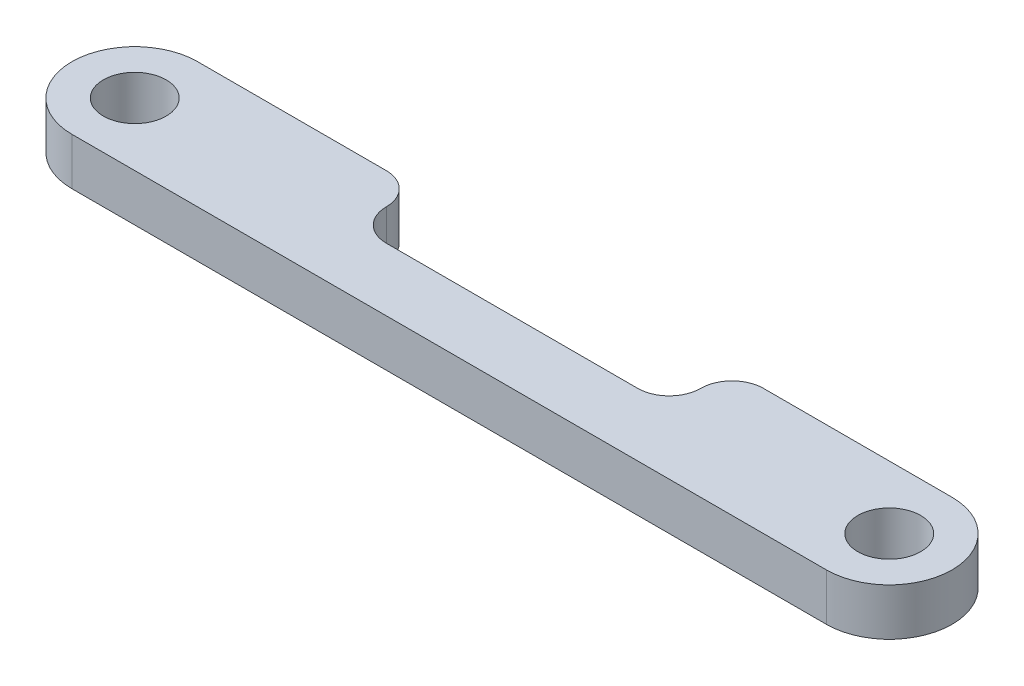
ISO-10303-21;
HEADER;
FILE_DESCRIPTION(('STEP AP214'),'2;1');
FILE_NAME('part.step','',(''),(''),'','','');
FILE_SCHEMA(('AUTOMOTIVE_DESIGN { 1 0 10303 214 1 1 1 1 }'));
ENDSEC;
DATA;
#1=APPLICATION_CONTEXT('core data for automotive mechanical design processes');
#2=APPLICATION_PROTOCOL_DEFINITION('international standard','automotive_design',2000,#1);
#3=PRODUCT_CONTEXT('',#1,'mechanical');
#4=PRODUCT('Part','Part','',(#3));
#5=PRODUCT_RELATED_PRODUCT_CATEGORY('part','',(#4));
#6=PRODUCT_DEFINITION_FORMATION('','',#4);
#7=PRODUCT_DEFINITION_CONTEXT('part definition',#1,'design');
#8=PRODUCT_DEFINITION('design','',#6,#7);
#9=PRODUCT_DEFINITION_SHAPE('','',#8);
#10=(LENGTH_UNIT() NAMED_UNIT(*) SI_UNIT(.MILLI.,.METRE.));
#11=(NAMED_UNIT(*) PLANE_ANGLE_UNIT() SI_UNIT($,.RADIAN.));
#12=(NAMED_UNIT(*) SI_UNIT($,.STERADIAN.) SOLID_ANGLE_UNIT());
#13=UNCERTAINTY_MEASURE_WITH_UNIT(LENGTH_MEASURE(1.E-05),#10,'distance_accuracy_value','');
#14=(GEOMETRIC_REPRESENTATION_CONTEXT(3) GLOBAL_UNCERTAINTY_ASSIGNED_CONTEXT((#13)) GLOBAL_UNIT_ASSIGNED_CONTEXT((#10,
#11,#12)) REPRESENTATION_CONTEXT('',''));
#15=CARTESIAN_POINT('',(0.,0.,0.));
#16=DIRECTION('',(0.,0.,1.));
#17=DIRECTION('',(1.,0.,0.));
#18=AXIS2_PLACEMENT_3D('',#15,#16,#17);
#19=CARTESIAN_POINT('',(15.24,1.905,0.));
#20=DIRECTION('',(0.,1.,0.));
#21=DIRECTION('',(0.,0.,1.));
#22=AXIS2_PLACEMENT_3D('',#19,#20,#21);
#23=PLANE('',#22);
#24=CARTESIAN_POINT('',(-15.24,1.905,0.));
#25=DIRECTION('',(0.,1.,0.));
#26=DIRECTION('',(0.,0.,1.));
#27=AXIS2_PLACEMENT_3D('',#24,#25,#26);
#28=CIRCLE('',#27,1.27);
#29=CARTESIAN_POINT('',(-15.24,1.905,-1.27));
#30=VERTEX_POINT('',#29);
#31=EDGE_CURVE('E151',#30,#30,#28,.T.);
#32=ORIENTED_EDGE('',*,*,#31,.F.);
#33=EDGE_LOOP('',(#32));
#34=FACE_BOUND('',#33,.T.);
#35=DIRECTION('',(-1.,0.,0.));
#36=VECTOR('',#35,1.);
#37=CARTESIAN_POINT('',(15.24,1.905,-2.54));
#38=LINE('',#37,#36);
#39=CARTESIAN_POINT('',(15.24,1.905,-2.54));
#40=VERTEX_POINT('',#39);
#41=CARTESIAN_POINT('',(7.62,1.905,-2.54));
#42=VERTEX_POINT('',#41);
#43=EDGE_CURVE('E144',#40,#42,#38,.T.);
#44=ORIENTED_EDGE('',*,*,#43,.T.);
#45=CARTESIAN_POINT('',(7.62,1.905,-1.27));
#46=DIRECTION('',(0.,1.,0.));
#47=DIRECTION('',(0.,0.,1.));
#48=AXIS2_PLACEMENT_3D('',#45,#46,#47);
#49=CIRCLE('',#48,1.27);
#50=CARTESIAN_POINT('',(6.35,1.905,-1.27));
#51=VERTEX_POINT('',#50);
#52=EDGE_CURVE('E175',#42,#51,#49,.T.);
#53=ORIENTED_EDGE('',*,*,#52,.T.);
#54=CARTESIAN_POINT('',(5.08,1.905,-1.27));
#55=DIRECTION('',(0.,1.,0.));
#56=DIRECTION('',(0.,0.,1.));
#57=AXIS2_PLACEMENT_3D('',#54,#55,#56);
#58=CIRCLE('',#57,1.27);
#59=CARTESIAN_POINT('',(5.08,1.905,0.));
#60=VERTEX_POINT('',#59);
#61=EDGE_CURVE('E57',#51,#60,#58,.F.);
#62=ORIENTED_EDGE('',*,*,#61,.T.);
#63=DIRECTION('',(-1.,0.,0.));
#64=VECTOR('',#63,1.);
#65=CARTESIAN_POINT('',(-6.35,1.905,0.));
#66=LINE('',#65,#64);
#67=CARTESIAN_POINT('',(-5.08,1.905,0.));
#68=VERTEX_POINT('',#67);
#69=EDGE_CURVE('E146',#60,#68,#66,.T.);
#70=ORIENTED_EDGE('',*,*,#69,.T.);
#71=CARTESIAN_POINT('',(-5.08,1.905,-1.27));
#72=DIRECTION('',(0.,1.,0.));
#73=DIRECTION('',(0.,0.,1.));
#74=AXIS2_PLACEMENT_3D('',#71,#72,#73);
#75=CIRCLE('',#74,1.27);
#76=CARTESIAN_POINT('',(-6.35,1.905,-1.27));
#77=VERTEX_POINT('',#76);
#78=EDGE_CURVE('E11',#68,#77,#75,.F.);
#79=ORIENTED_EDGE('',*,*,#78,.T.);
#80=CARTESIAN_POINT('',(-7.62,1.905,-1.27));
#81=DIRECTION('',(0.,1.,0.));
#82=DIRECTION('',(0.,0.,1.));
#83=AXIS2_PLACEMENT_3D('',#80,#81,#82);
#84=CIRCLE('',#83,1.27);
#85=CARTESIAN_POINT('',(-7.62,1.905,-2.54));
#86=VERTEX_POINT('',#85);
#87=EDGE_CURVE('E119',#77,#86,#84,.T.);
#88=ORIENTED_EDGE('',*,*,#87,.T.);
#89=DIRECTION('',(-1.,0.,0.));
#90=VECTOR('',#89,1.);
#91=CARTESIAN_POINT('',(-15.24,1.905,-2.54));
#92=LINE('',#91,#90);
#93=CARTESIAN_POINT('',(-15.24,1.905,-2.54));
#94=VERTEX_POINT('',#93);
#95=EDGE_CURVE('E111',#86,#94,#92,.T.);
#96=ORIENTED_EDGE('',*,*,#95,.T.);
#97=CARTESIAN_POINT('',(-15.24,1.905,0.));
#98=DIRECTION('',(0.,1.,0.));
#99=DIRECTION('',(0.,0.,-1.));
#100=AXIS2_PLACEMENT_3D('',#97,#98,#99);
#101=CIRCLE('',#100,2.54);
#102=CARTESIAN_POINT('',(-15.24,1.905,2.54));
#103=VERTEX_POINT('',#102);
#104=EDGE_CURVE('E116',#94,#103,#101,.T.);
#105=ORIENTED_EDGE('',*,*,#104,.T.);
#106=DIRECTION('',(1.,0.,0.));
#107=VECTOR('',#106,1.);
#108=CARTESIAN_POINT('',(-15.24,1.905,2.54));
#109=LINE('',#108,#107);
#110=CARTESIAN_POINT('',(15.24,1.905,2.54));
#111=VERTEX_POINT('',#110);
#112=EDGE_CURVE('E137',#103,#111,#109,.T.);
#113=ORIENTED_EDGE('',*,*,#112,.T.);
#114=CARTESIAN_POINT('',(15.24,1.905,0.));
#115=DIRECTION('',(0.,1.,0.));
#116=DIRECTION('',(0.,0.,1.));
#117=AXIS2_PLACEMENT_3D('',#114,#115,#116);
#118=CIRCLE('',#117,2.54);
#119=EDGE_CURVE('E139',#111,#40,#118,.T.);
#120=ORIENTED_EDGE('',*,*,#119,.T.);
#121=EDGE_LOOP('',(#44,#53,#62,#70,#79,#88,#96,#105,#113,#120));
#122=FACE_BOUND('',#121,.T.);
#123=CARTESIAN_POINT('',(15.24,1.905,0.));
#124=DIRECTION('',(0.,1.,0.));
#125=DIRECTION('',(0.,0.,1.));
#126=AXIS2_PLACEMENT_3D('',#123,#124,#125);
#127=CIRCLE('',#126,1.27);
#128=CARTESIAN_POINT('',(15.24,1.905,-1.27));
#129=VERTEX_POINT('',#128);
#130=EDGE_CURVE('E193',#129,#129,#127,.T.);
#131=ORIENTED_EDGE('',*,*,#130,.F.);
#132=EDGE_LOOP('',(#131));
#133=FACE_BOUND('',#132,.T.);
#134=ADVANCED_FACE('F34',(#34,#122,#133),#23,.T.);
#135=CARTESIAN_POINT('',(15.24,0.,0.));
#136=DIRECTION('',(0.,1.,0.));
#137=DIRECTION('',(0.,0.,1.));
#138=AXIS2_PLACEMENT_3D('',#135,#136,#137);
#139=PLANE('',#138);
#140=DIRECTION('',(-1.,0.,0.));
#141=VECTOR('',#140,1.);
#142=CARTESIAN_POINT('',(-6.35,0.,0.));
#143=LINE('',#142,#141);
#144=CARTESIAN_POINT('',(5.08,0.,0.));
#145=VERTEX_POINT('',#144);
#146=CARTESIAN_POINT('',(-5.08,0.,0.));
#147=VERTEX_POINT('',#146);
#148=EDGE_CURVE('E122',#145,#147,#143,.T.);
#149=ORIENTED_EDGE('',*,*,#148,.F.);
#150=CARTESIAN_POINT('',(5.08,0.,-1.27));
#151=DIRECTION('',(0.,1.,0.));
#152=DIRECTION('',(0.,0.,1.));
#153=AXIS2_PLACEMENT_3D('',#150,#151,#152);
#154=CIRCLE('',#153,1.27);
#155=CARTESIAN_POINT('',(6.35,0.,-1.27));
#156=VERTEX_POINT('',#155);
#157=EDGE_CURVE('E183',#145,#156,#154,.T.);
#158=ORIENTED_EDGE('',*,*,#157,.T.);
#159=CARTESIAN_POINT('',(7.62,0.,-1.27));
#160=DIRECTION('',(0.,1.,0.));
#161=DIRECTION('',(0.,0.,1.));
#162=AXIS2_PLACEMENT_3D('',#159,#160,#161);
#163=CIRCLE('',#162,1.27);
#164=CARTESIAN_POINT('',(7.62,0.,-2.54));
#165=VERTEX_POINT('',#164);
#166=EDGE_CURVE('E169',#156,#165,#163,.F.);
#167=ORIENTED_EDGE('',*,*,#166,.T.);
#168=DIRECTION('',(-1.,0.,0.));
#169=VECTOR('',#168,1.);
#170=CARTESIAN_POINT('',(15.24,0.,-2.54));
#171=LINE('',#170,#169);
#172=CARTESIAN_POINT('',(15.24,0.,-2.54));
#173=VERTEX_POINT('',#172);
#174=EDGE_CURVE('E157',#173,#165,#171,.T.);
#175=ORIENTED_EDGE('',*,*,#174,.F.);
#176=CARTESIAN_POINT('',(15.24,0.,0.));
#177=DIRECTION('',(0.,1.,0.));
#178=DIRECTION('',(0.,0.,1.));
#179=AXIS2_PLACEMENT_3D('',#176,#177,#178);
#180=CIRCLE('',#179,2.54);
#181=CARTESIAN_POINT('',(15.24,0.,2.54));
#182=VERTEX_POINT('',#181);
#183=EDGE_CURVE('E155',#182,#173,#180,.T.);
#184=ORIENTED_EDGE('',*,*,#183,.F.);
#185=DIRECTION('',(1.,0.,0.));
#186=VECTOR('',#185,1.);
#187=CARTESIAN_POINT('',(-15.24,0.,2.54));
#188=LINE('',#187,#186);
#189=CARTESIAN_POINT('',(-15.24,0.,2.54));
#190=VERTEX_POINT('',#189);
#191=EDGE_CURVE('E153',#190,#182,#188,.T.);
#192=ORIENTED_EDGE('',*,*,#191,.F.);
#193=CARTESIAN_POINT('',(-15.24,0.,0.));
#194=DIRECTION('',(0.,1.,0.));
#195=DIRECTION('',(0.,0.,-1.));
#196=AXIS2_PLACEMENT_3D('',#193,#194,#195);
#197=CIRCLE('',#196,2.54);
#198=CARTESIAN_POINT('',(-15.24,0.,-2.54));
#199=VERTEX_POINT('',#198);
#200=EDGE_CURVE('E150',#199,#190,#197,.T.);
#201=ORIENTED_EDGE('',*,*,#200,.F.);
#202=DIRECTION('',(-1.,0.,0.));
#203=VECTOR('',#202,1.);
#204=CARTESIAN_POINT('',(-15.24,0.,-2.54));
#205=LINE('',#204,#203);
#206=CARTESIAN_POINT('',(-7.62,0.,-2.54));
#207=VERTEX_POINT('',#206);
#208=EDGE_CURVE('E128',#207,#199,#205,.T.);
#209=ORIENTED_EDGE('',*,*,#208,.F.);
#210=CARTESIAN_POINT('',(-7.62,0.,-1.27));
#211=DIRECTION('',(0.,1.,0.));
#212=DIRECTION('',(0.,0.,1.));
#213=AXIS2_PLACEMENT_3D('',#210,#211,#212);
#214=CIRCLE('',#213,1.27);
#215=CARTESIAN_POINT('',(-6.35,0.,-1.27));
#216=VERTEX_POINT('',#215);
#217=EDGE_CURVE('E131',#207,#216,#214,.F.);
#218=ORIENTED_EDGE('',*,*,#217,.T.);
#219=CARTESIAN_POINT('',(-5.08,0.,-1.27));
#220=DIRECTION('',(0.,1.,0.));
#221=DIRECTION('',(0.,0.,1.));
#222=AXIS2_PLACEMENT_3D('',#219,#220,#221);
#223=CIRCLE('',#222,1.27);
#224=EDGE_CURVE('E43',#216,#147,#223,.T.);
#225=ORIENTED_EDGE('',*,*,#224,.T.);
#226=EDGE_LOOP('',(#149,#158,#167,#175,#184,#192,#201,#209,#218,#225));
#227=FACE_BOUND('',#226,.T.);
#228=CARTESIAN_POINT('',(-15.24,0.,0.));
#229=DIRECTION('',(0.,1.,0.));
#230=DIRECTION('',(0.,0.,1.));
#231=AXIS2_PLACEMENT_3D('',#228,#229,#230);
#232=CIRCLE('',#231,1.27);
#233=CARTESIAN_POINT('',(-15.24,0.,-1.27));
#234=VERTEX_POINT('',#233);
#235=EDGE_CURVE('E256',#234,#234,#232,.T.);
#236=ORIENTED_EDGE('',*,*,#235,.T.);
#237=EDGE_LOOP('',(#236));
#238=FACE_BOUND('',#237,.T.);
#239=CARTESIAN_POINT('',(15.24,0.,0.));
#240=DIRECTION('',(0.,1.,0.));
#241=DIRECTION('',(0.,0.,1.));
#242=AXIS2_PLACEMENT_3D('',#239,#240,#241);
#243=CIRCLE('',#242,1.27);
#244=CARTESIAN_POINT('',(15.24,0.,-1.27));
#245=VERTEX_POINT('',#244);
#246=EDGE_CURVE('E188',#245,#245,#243,.T.);
#247=ORIENTED_EDGE('',*,*,#246,.T.);
#248=EDGE_LOOP('',(#247));
#249=FACE_BOUND('',#248,.T.);
#250=ADVANCED_FACE('F202',(#227,#238,#249),#139,.F.);
#251=CARTESIAN_POINT('',(-15.24,1.905,-2.54));
#252=DIRECTION('',(0.,0.,1.));
#253=DIRECTION('',(1.,0.,0.));
#254=AXIS2_PLACEMENT_3D('',#251,#252,#253);
#255=PLANE('',#254);
#256=ORIENTED_EDGE('',*,*,#95,.F.);
#257=DIRECTION('',(0.,-1.,0.));
#258=VECTOR('',#257,1.);
#259=CARTESIAN_POINT('',(-7.62,1.905,-2.54));
#260=LINE('',#259,#258);
#261=EDGE_CURVE('E181',#86,#207,#260,.T.);
#262=ORIENTED_EDGE('',*,*,#261,.T.);
#263=ORIENTED_EDGE('',*,*,#208,.T.);
#264=DIRECTION('',(0.,-1.,0.));
#265=VECTOR('',#264,1.);
#266=CARTESIAN_POINT('',(-15.24,1.905,-2.54));
#267=LINE('',#266,#265);
#268=EDGE_CURVE('E125',#94,#199,#267,.T.);
#269=ORIENTED_EDGE('',*,*,#268,.F.);
#270=EDGE_LOOP('',(#256,#262,#263,#269));
#271=FACE_BOUND('',#270,.T.);
#272=ADVANCED_FACE('F126',(#271),#255,.F.);
#273=CARTESIAN_POINT('',(-15.24,1.905,0.));
#274=DIRECTION('',(0.,-1.,0.));
#275=DIRECTION('',(0.,0.,-1.));
#276=AXIS2_PLACEMENT_3D('',#273,#274,#275);
#277=CYLINDRICAL_SURFACE('',#276,2.54);
#278=ORIENTED_EDGE('',*,*,#200,.T.);
#279=DIRECTION('',(0.,-1.,0.));
#280=VECTOR('',#279,1.);
#281=CARTESIAN_POINT('',(-15.24,1.905,2.54));
#282=LINE('',#281,#280);
#283=EDGE_CURVE('E132',#103,#190,#282,.T.);
#284=ORIENTED_EDGE('',*,*,#283,.F.);
#285=ORIENTED_EDGE('',*,*,#104,.F.);
#286=ORIENTED_EDGE('',*,*,#268,.T.);
#287=EDGE_LOOP('',(#278,#284,#285,#286));
#288=FACE_BOUND('',#287,.T.);
#289=ADVANCED_FACE('F134',(#288),#277,.T.);
#290=CARTESIAN_POINT('',(-15.24,1.905,2.54));
#291=DIRECTION('',(0.,0.,-1.));
#292=DIRECTION('',(-1.,0.,0.));
#293=AXIS2_PLACEMENT_3D('',#290,#291,#292);
#294=PLANE('',#293);
#295=ORIENTED_EDGE('',*,*,#191,.T.);
#296=DIRECTION('',(0.,-1.,0.));
#297=VECTOR('',#296,1.);
#298=CARTESIAN_POINT('',(15.24,1.905,2.54));
#299=LINE('',#298,#297);
#300=EDGE_CURVE('E164',#111,#182,#299,.T.);
#301=ORIENTED_EDGE('',*,*,#300,.F.);
#302=ORIENTED_EDGE('',*,*,#112,.F.);
#303=ORIENTED_EDGE('',*,*,#283,.T.);
#304=EDGE_LOOP('',(#295,#301,#302,#303));
#305=FACE_BOUND('',#304,.T.);
#306=ADVANCED_FACE('F207',(#305),#294,.F.);
#307=CARTESIAN_POINT('',(15.24,1.905,0.));
#308=DIRECTION('',(0.,-1.,0.));
#309=DIRECTION('',(0.,0.,-1.));
#310=AXIS2_PLACEMENT_3D('',#307,#308,#309);
#311=CYLINDRICAL_SURFACE('',#310,2.54);
#312=ORIENTED_EDGE('',*,*,#183,.T.);
#313=DIRECTION('',(0.,-1.,0.));
#314=VECTOR('',#313,1.);
#315=CARTESIAN_POINT('',(15.24,1.905,-2.54));
#316=LINE('',#315,#314);
#317=EDGE_CURVE('E148',#40,#173,#316,.T.);
#318=ORIENTED_EDGE('',*,*,#317,.F.);
#319=ORIENTED_EDGE('',*,*,#119,.F.);
#320=ORIENTED_EDGE('',*,*,#300,.T.);
#321=EDGE_LOOP('',(#312,#318,#319,#320));
#322=FACE_BOUND('',#321,.T.);
#323=ADVANCED_FACE('F213',(#322),#311,.T.);
#324=CARTESIAN_POINT('',(15.24,1.905,-2.54));
#325=DIRECTION('',(0.,0.,1.));
#326=DIRECTION('',(1.,0.,0.));
#327=AXIS2_PLACEMENT_3D('',#324,#325,#326);
#328=PLANE('',#327);
#329=ORIENTED_EDGE('',*,*,#174,.T.);
#330=DIRECTION('',(0.,-1.,0.));
#331=VECTOR('',#330,1.);
#332=CARTESIAN_POINT('',(7.62,1.905,-2.54));
#333=LINE('',#332,#331);
#334=EDGE_CURVE('E171',#165,#42,#333,.F.);
#335=ORIENTED_EDGE('',*,*,#334,.T.);
#336=ORIENTED_EDGE('',*,*,#43,.F.);
#337=ORIENTED_EDGE('',*,*,#317,.T.);
#338=EDGE_LOOP('',(#329,#335,#336,#337));
#339=FACE_BOUND('',#338,.T.);
#340=ADVANCED_FACE('F216',(#339),#328,.F.);
#341=CARTESIAN_POINT('',(-6.35,1.905,0.));
#342=DIRECTION('',(0.,0.,1.));
#343=DIRECTION('',(1.,0.,0.));
#344=AXIS2_PLACEMENT_3D('',#341,#342,#343);
#345=PLANE('',#344);
#346=ORIENTED_EDGE('',*,*,#69,.F.);
#347=DIRECTION('',(0.,-1.,0.));
#348=VECTOR('',#347,1.);
#349=CARTESIAN_POINT('',(5.08,0.,0.));
#350=LINE('',#349,#348);
#351=EDGE_CURVE('E179',#60,#145,#350,.T.);
#352=ORIENTED_EDGE('',*,*,#351,.T.);
#353=ORIENTED_EDGE('',*,*,#148,.T.);
#354=DIRECTION('',(0.,-1.,0.));
#355=VECTOR('',#354,1.);
#356=CARTESIAN_POINT('',(-5.08,1.905,0.));
#357=LINE('',#356,#355);
#358=EDGE_CURVE('E177',#147,#68,#357,.F.);
#359=ORIENTED_EDGE('',*,*,#358,.T.);
#360=EDGE_LOOP('',(#346,#352,#353,#359));
#361=FACE_BOUND('',#360,.T.);
#362=ADVANCED_FACE('F224',(#361),#345,.F.);
#363=CARTESIAN_POINT('',(-15.24,1.905,0.));
#364=DIRECTION('',(0.,-1.,0.));
#365=DIRECTION('',(0.,0.,-1.));
#366=AXIS2_PLACEMENT_3D('',#363,#364,#365);
#367=CYLINDRICAL_SURFACE('',#366,1.27);
#368=CARTESIAN_POINT('',(-15.24,1.905,-1.27));
#369=CARTESIAN_POINT('',(-15.24,1.88515625,-1.27));
#370=CARTESIAN_POINT('',(-15.24,1.8653125,-1.27));
#371=CARTESIAN_POINT('',(-15.24,1.825625,-1.27));
#372=CARTESIAN_POINT('',(-15.24,1.80578125,-1.27));
#373=CARTESIAN_POINT('',(-15.24,1.76609375,-1.27));
#374=CARTESIAN_POINT('',(-15.24,1.74625,-1.27));
#375=CARTESIAN_POINT('',(-15.24,1.7065625,-1.27));
#376=CARTESIAN_POINT('',(-15.24,1.68671875,-1.27));
#377=CARTESIAN_POINT('',(-15.24,1.64703125,-1.27));
#378=CARTESIAN_POINT('',(-15.24,1.6271875,-1.27));
#379=CARTESIAN_POINT('',(-15.24,1.5875,-1.27));
#380=CARTESIAN_POINT('',(-15.24,1.56765625,-1.27));
#381=CARTESIAN_POINT('',(-15.24,1.52796875,-1.27));
#382=CARTESIAN_POINT('',(-15.24,1.508125,-1.27));
#383=CARTESIAN_POINT('',(-15.24,1.4684375,-1.27));
#384=CARTESIAN_POINT('',(-15.24,1.44859375,-1.27));
#385=CARTESIAN_POINT('',(-15.24,1.40890625,-1.27));
#386=CARTESIAN_POINT('',(-15.24,1.3890625,-1.27));
#387=CARTESIAN_POINT('',(-15.24,1.349375,-1.27));
#388=CARTESIAN_POINT('',(-15.24,1.32953125,-1.27));
#389=CARTESIAN_POINT('',(-15.24,1.28984375,-1.27));
#390=CARTESIAN_POINT('',(-15.24,1.27,-1.27));
#391=CARTESIAN_POINT('',(-15.24,1.2303125,-1.27));
#392=CARTESIAN_POINT('',(-15.24,1.21046875,-1.27));
#393=CARTESIAN_POINT('',(-15.24,1.17078125,-1.27));
#394=CARTESIAN_POINT('',(-15.24,1.1509375,-1.27));
#395=CARTESIAN_POINT('',(-15.24,1.11125,-1.27));
#396=CARTESIAN_POINT('',(-15.24,1.09140625,-1.27));
#397=CARTESIAN_POINT('',(-15.24,1.05171875,-1.27));
#398=CARTESIAN_POINT('',(-15.24,1.031875,-1.27));
#399=CARTESIAN_POINT('',(-15.24,0.9921875,-1.27));
#400=CARTESIAN_POINT('',(-15.24,0.97234375,-1.27));
#401=CARTESIAN_POINT('',(-15.24,0.93265625,-1.27));
#402=CARTESIAN_POINT('',(-15.24,0.9128125,-1.27));
#403=CARTESIAN_POINT('',(-15.24,0.873125,-1.27));
#404=CARTESIAN_POINT('',(-15.24,0.85328125,-1.27));
#405=CARTESIAN_POINT('',(-15.24,0.81359375,-1.27));
#406=CARTESIAN_POINT('',(-15.24,0.79375,-1.27));
#407=CARTESIAN_POINT('',(-15.24,0.7540625,-1.27));
#408=CARTESIAN_POINT('',(-15.24,0.73421875,-1.27));
#409=CARTESIAN_POINT('',(-15.24,0.69453125,-1.27));
#410=CARTESIAN_POINT('',(-15.24,0.6746875,-1.27));
#411=CARTESIAN_POINT('',(-15.24,0.635,-1.27));
#412=CARTESIAN_POINT('',(-15.24,0.61515625,-1.27));
#413=CARTESIAN_POINT('',(-15.24,0.57546875,-1.27));
#414=CARTESIAN_POINT('',(-15.24,0.555625,-1.27));
#415=CARTESIAN_POINT('',(-15.24,0.5159375,-1.27));
#416=CARTESIAN_POINT('',(-15.24,0.49609375,-1.27));
#417=CARTESIAN_POINT('',(-15.24,0.45640625,-1.27));
#418=CARTESIAN_POINT('',(-15.24,0.4365625,-1.27));
#419=CARTESIAN_POINT('',(-15.24,0.396875,-1.27));
#420=CARTESIAN_POINT('',(-15.24,0.37703125,-1.27));
#421=CARTESIAN_POINT('',(-15.24,0.33734375,-1.27));
#422=CARTESIAN_POINT('',(-15.24,0.3175,-1.27));
#423=CARTESIAN_POINT('',(-15.24,0.2778125,-1.27));
#424=CARTESIAN_POINT('',(-15.24,0.25796875,-1.27));
#425=CARTESIAN_POINT('',(-15.24,0.21828125,-1.27));
#426=CARTESIAN_POINT('',(-15.24,0.1984375,-1.27));
#427=CARTESIAN_POINT('',(-15.24,0.15875,-1.27));
#428=CARTESIAN_POINT('',(-15.24,0.13890625,-1.27));
#429=CARTESIAN_POINT('',(-15.24,0.09921875,-1.27));
#430=CARTESIAN_POINT('',(-15.24,0.0793749999999999,-1.27));
#431=CARTESIAN_POINT('',(-15.24,0.0396874999999999,-1.27));
#432=CARTESIAN_POINT('',(-15.24,0.01984375,-1.27));
#433=CARTESIAN_POINT('',(-15.24,0.,-1.27));
#434=B_SPLINE_CURVE_WITH_KNOTS('',3,(#368,#369,#370,#371,#372,#373,#374,#375,#376,#377,#378,
#379,#380,#381,#382,#383,#384,#385,#386,#387,#388,#389,#390,#391,#392,#393,#394,#395,#396,#397,
#398,#399,#400,#401,#402,#403,#404,#405,#406,#407,#408,#409,#410,#411,#412,#413,#414,#415,#416,
#417,#418,#419,#420,#421,#422,#423,#424,#425,#426,#427,#428,#429,#430,#431,#432,#433),
.UNSPECIFIED.,.F.,.F.,(4,2,2,2,2,2,2,2,2,2,2,2,2,2,2,2,2,2,2,2,2,2,2,2,2,2,2,2,2,2,2,2,4),(0.,
0.0595312500000001,0.1190625,0.17859375,0.238125,0.29765625,0.3571875,0.41671875,0.47625,
0.53578125,0.5953125,0.65484375,0.714375,0.77390625,0.8334375,0.89296875,0.9525,1.01203125,
1.0715625,1.13109375,1.190625,1.25015625,1.3096875,1.36921875,1.42875,1.48828125,1.5478125,
1.60734375,1.666875,1.72640625,1.7859375,1.84546875,1.905),.UNSPECIFIED.);
#435=EDGE_CURVE('BSEAM226',#30,#234,#434,.T.);
#436=ORIENTED_EDGE('',*,*,#31,.T.);
#437=ORIENTED_EDGE('',*,*,#235,.F.);
#438=ORIENTED_EDGE('',*,*,#435,.T.);
#439=ORIENTED_EDGE('',*,*,#435,.F.);
#440=EDGE_LOOP('',(#436,#438,#437,#439));
#441=FACE_BOUND('',#440,.T.);
#442=ADVANCED_FACE('F226',(#441),#367,.F.);
#443=CARTESIAN_POINT('',(15.24,1.905,0.));
#444=DIRECTION('',(0.,-1.,0.));
#445=DIRECTION('',(0.,0.,-1.));
#446=AXIS2_PLACEMENT_3D('',#443,#444,#445);
#447=CYLINDRICAL_SURFACE('',#446,1.27);
#448=CARTESIAN_POINT('',(15.24,1.905,-1.27));
#449=CARTESIAN_POINT('',(15.24,1.88515625,-1.27));
#450=CARTESIAN_POINT('',(15.24,1.8653125,-1.27));
#451=CARTESIAN_POINT('',(15.24,1.825625,-1.27));
#452=CARTESIAN_POINT('',(15.24,1.80578125,-1.27));
#453=CARTESIAN_POINT('',(15.24,1.76609375,-1.27));
#454=CARTESIAN_POINT('',(15.24,1.74625,-1.27));
#455=CARTESIAN_POINT('',(15.24,1.7065625,-1.27));
#456=CARTESIAN_POINT('',(15.24,1.68671875,-1.27));
#457=CARTESIAN_POINT('',(15.24,1.64703125,-1.27));
#458=CARTESIAN_POINT('',(15.24,1.6271875,-1.27));
#459=CARTESIAN_POINT('',(15.24,1.5875,-1.27));
#460=CARTESIAN_POINT('',(15.24,1.56765625,-1.27));
#461=CARTESIAN_POINT('',(15.24,1.52796875,-1.27));
#462=CARTESIAN_POINT('',(15.24,1.508125,-1.27));
#463=CARTESIAN_POINT('',(15.24,1.4684375,-1.27));
#464=CARTESIAN_POINT('',(15.24,1.44859375,-1.27));
#465=CARTESIAN_POINT('',(15.24,1.40890625,-1.27));
#466=CARTESIAN_POINT('',(15.24,1.3890625,-1.27));
#467=CARTESIAN_POINT('',(15.24,1.349375,-1.27));
#468=CARTESIAN_POINT('',(15.24,1.32953125,-1.27));
#469=CARTESIAN_POINT('',(15.24,1.28984375,-1.27));
#470=CARTESIAN_POINT('',(15.24,1.27,-1.27));
#471=CARTESIAN_POINT('',(15.24,1.2303125,-1.27));
#472=CARTESIAN_POINT('',(15.24,1.21046875,-1.27));
#473=CARTESIAN_POINT('',(15.24,1.17078125,-1.27));
#474=CARTESIAN_POINT('',(15.24,1.1509375,-1.27));
#475=CARTESIAN_POINT('',(15.24,1.11125,-1.27));
#476=CARTESIAN_POINT('',(15.24,1.09140625,-1.27));
#477=CARTESIAN_POINT('',(15.24,1.05171875,-1.27));
#478=CARTESIAN_POINT('',(15.24,1.031875,-1.27));
#479=CARTESIAN_POINT('',(15.24,0.9921875,-1.27));
#480=CARTESIAN_POINT('',(15.24,0.97234375,-1.27));
#481=CARTESIAN_POINT('',(15.24,0.93265625,-1.27));
#482=CARTESIAN_POINT('',(15.24,0.9128125,-1.27));
#483=CARTESIAN_POINT('',(15.24,0.873125,-1.27));
#484=CARTESIAN_POINT('',(15.24,0.85328125,-1.27));
#485=CARTESIAN_POINT('',(15.24,0.81359375,-1.27));
#486=CARTESIAN_POINT('',(15.24,0.79375,-1.27));
#487=CARTESIAN_POINT('',(15.24,0.7540625,-1.27));
#488=CARTESIAN_POINT('',(15.24,0.73421875,-1.27));
#489=CARTESIAN_POINT('',(15.24,0.69453125,-1.27));
#490=CARTESIAN_POINT('',(15.24,0.6746875,-1.27));
#491=CARTESIAN_POINT('',(15.24,0.635,-1.27));
#492=CARTESIAN_POINT('',(15.24,0.61515625,-1.27));
#493=CARTESIAN_POINT('',(15.24,0.57546875,-1.27));
#494=CARTESIAN_POINT('',(15.24,0.555625,-1.27));
#495=CARTESIAN_POINT('',(15.24,0.5159375,-1.27));
#496=CARTESIAN_POINT('',(15.24,0.49609375,-1.27));
#497=CARTESIAN_POINT('',(15.24,0.45640625,-1.27));
#498=CARTESIAN_POINT('',(15.24,0.4365625,-1.27));
#499=CARTESIAN_POINT('',(15.24,0.396875,-1.27));
#500=CARTESIAN_POINT('',(15.24,0.37703125,-1.27));
#501=CARTESIAN_POINT('',(15.24,0.33734375,-1.27));
#502=CARTESIAN_POINT('',(15.24,0.3175,-1.27));
#503=CARTESIAN_POINT('',(15.24,0.2778125,-1.27));
#504=CARTESIAN_POINT('',(15.24,0.25796875,-1.27));
#505=CARTESIAN_POINT('',(15.24,0.21828125,-1.27));
#506=CARTESIAN_POINT('',(15.24,0.1984375,-1.27));
#507=CARTESIAN_POINT('',(15.24,0.15875,-1.27));
#508=CARTESIAN_POINT('',(15.24,0.13890625,-1.27));
#509=CARTESIAN_POINT('',(15.24,0.09921875,-1.27));
#510=CARTESIAN_POINT('',(15.24,0.0793749999999999,-1.27));
#511=CARTESIAN_POINT('',(15.24,0.0396874999999999,-1.27));
#512=CARTESIAN_POINT('',(15.24,0.01984375,-1.27));
#513=CARTESIAN_POINT('',(15.24,0.,-1.27));
#514=B_SPLINE_CURVE_WITH_KNOTS('',3,(#448,#449,#450,#451,#452,#453,#454,#455,#456,#457,#458,
#459,#460,#461,#462,#463,#464,#465,#466,#467,#468,#469,#470,#471,#472,#473,#474,#475,#476,#477,
#478,#479,#480,#481,#482,#483,#484,#485,#486,#487,#488,#489,#490,#491,#492,#493,#494,#495,#496,
#497,#498,#499,#500,#501,#502,#503,#504,#505,#506,#507,#508,#509,#510,#511,#512,#513),
.UNSPECIFIED.,.F.,.F.,(4,2,2,2,2,2,2,2,2,2,2,2,2,2,2,2,2,2,2,2,2,2,2,2,2,2,2,2,2,2,2,2,4),(0.,
0.0595312500000001,0.1190625,0.17859375,0.238125,0.29765625,0.3571875,0.41671875,0.47625,
0.53578125,0.5953125,0.65484375,0.714375,0.77390625,0.8334375,0.89296875,0.9525,1.01203125,
1.0715625,1.13109375,1.190625,1.25015625,1.3096875,1.36921875,1.42875,1.48828125,1.5478125,
1.60734375,1.666875,1.72640625,1.7859375,1.84546875,1.905),.UNSPECIFIED.);
#515=EDGE_CURVE('BSEAM232',#129,#245,#514,.T.);
#516=ORIENTED_EDGE('',*,*,#130,.T.);
#517=ORIENTED_EDGE('',*,*,#246,.F.);
#518=ORIENTED_EDGE('',*,*,#515,.T.);
#519=ORIENTED_EDGE('',*,*,#515,.F.);
#520=EDGE_LOOP('',(#516,#518,#517,#519));
#521=FACE_BOUND('',#520,.T.);
#522=ADVANCED_FACE('F232',(#521),#447,.F.);
#523=CARTESIAN_POINT('',(5.08,1.905,-1.27));
#524=DIRECTION('',(0.,1.,0.));
#525=DIRECTION('',(0.,0.,1.));
#526=AXIS2_PLACEMENT_3D('',#523,#524,#525);
#527=CYLINDRICAL_SURFACE('',#526,1.27);
#528=ORIENTED_EDGE('',*,*,#351,.F.);
#529=ORIENTED_EDGE('',*,*,#61,.F.);
#530=DIRECTION('',(0.,-1.,0.));
#531=VECTOR('',#530,1.);
#532=CARTESIAN_POINT('',(6.35,1.905,-1.27));
#533=LINE('',#532,#531);
#534=EDGE_CURVE('E186',#156,#51,#533,.F.);
#535=ORIENTED_EDGE('',*,*,#534,.F.);
#536=ORIENTED_EDGE('',*,*,#157,.F.);
#537=EDGE_LOOP('',(#528,#529,#535,#536));
#538=FACE_BOUND('',#537,.T.);
#539=ADVANCED_FACE('F221',(#538),#527,.F.);
#540=CARTESIAN_POINT('',(7.62,1.905,-1.27));
#541=DIRECTION('',(0.,-1.,0.));
#542=DIRECTION('',(0.,0.,-1.));
#543=AXIS2_PLACEMENT_3D('',#540,#541,#542);
#544=CYLINDRICAL_SURFACE('',#543,1.27);
#545=ORIENTED_EDGE('',*,*,#52,.F.);
#546=ORIENTED_EDGE('',*,*,#334,.F.);
#547=ORIENTED_EDGE('',*,*,#166,.F.);
#548=ORIENTED_EDGE('',*,*,#534,.T.);
#549=EDGE_LOOP('',(#545,#546,#547,#548));
#550=FACE_BOUND('',#549,.T.);
#551=ADVANCED_FACE('F218',(#550),#544,.T.);
#552=CARTESIAN_POINT('',(-7.62,1.905,-1.27));
#553=DIRECTION('',(0.,-1.,0.));
#554=DIRECTION('',(0.,0.,-1.));
#555=AXIS2_PLACEMENT_3D('',#552,#553,#554);
#556=CYLINDRICAL_SURFACE('',#555,1.27);
#557=ORIENTED_EDGE('',*,*,#261,.F.);
#558=ORIENTED_EDGE('',*,*,#87,.F.);
#559=DIRECTION('',(0.,-1.,0.));
#560=VECTOR('',#559,1.);
#561=CARTESIAN_POINT('',(-6.35,1.905,-1.27));
#562=LINE('',#561,#560);
#563=EDGE_CURVE('E38',#216,#77,#562,.F.);
#564=ORIENTED_EDGE('',*,*,#563,.F.);
#565=ORIENTED_EDGE('',*,*,#217,.F.);
#566=EDGE_LOOP('',(#557,#558,#564,#565));
#567=FACE_BOUND('',#566,.T.);
#568=ADVANCED_FACE('F36',(#567),#556,.T.);
#569=CARTESIAN_POINT('',(-5.08,1.905,-1.27));
#570=DIRECTION('',(0.,1.,0.));
#571=DIRECTION('',(0.,0.,1.));
#572=AXIS2_PLACEMENT_3D('',#569,#570,#571);
#573=CYLINDRICAL_SURFACE('',#572,1.27);
#574=ORIENTED_EDGE('',*,*,#78,.F.);
#575=ORIENTED_EDGE('',*,*,#358,.F.);
#576=ORIENTED_EDGE('',*,*,#224,.F.);
#577=ORIENTED_EDGE('',*,*,#563,.T.);
#578=EDGE_LOOP('',(#574,#575,#576,#577));
#579=FACE_BOUND('',#578,.T.);
#580=ADVANCED_FACE('F197',(#579),#573,.F.);
#581=CLOSED_SHELL('',(#134,#250,#272,#289,#306,#323,#340,#362,#442,#522,#539,#551,#568,#580));
#582=MANIFOLD_SOLID_BREP('B2',#581);
#583=ADVANCED_BREP_SHAPE_REPRESENTATION('',(#18,#582),#14);
#584=SHAPE_DEFINITION_REPRESENTATION(#9,#583);
ENDSEC;
END-ISO-10303-21;
